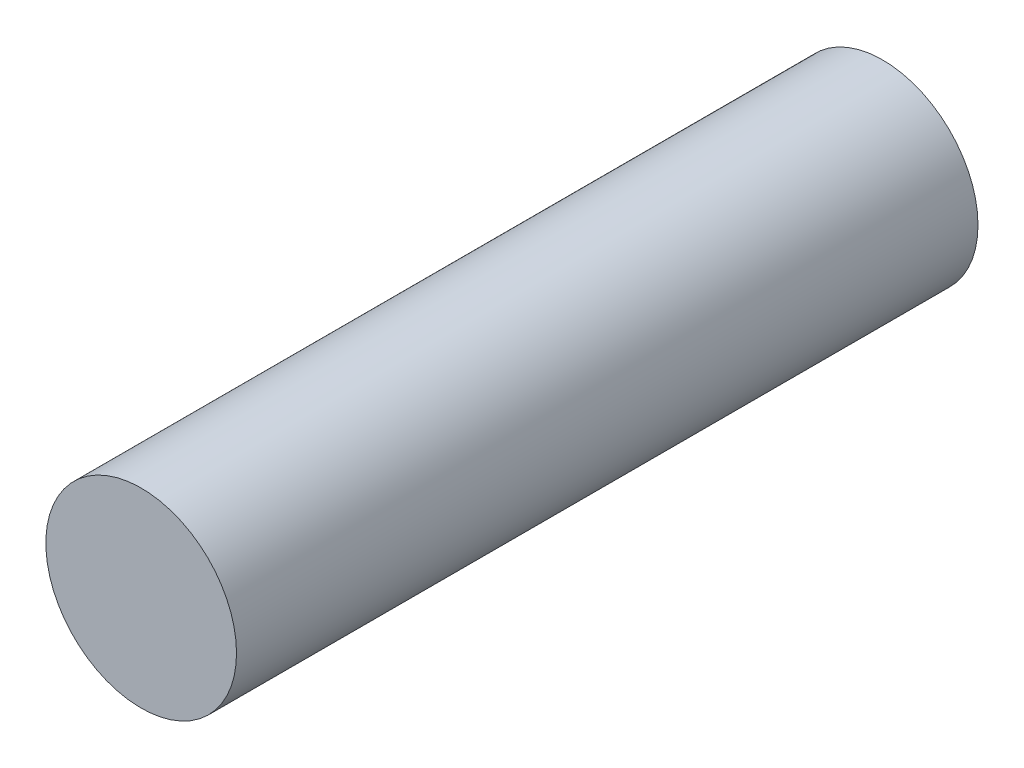
ISO-10303-21;
HEADER;
FILE_DESCRIPTION(('STEP AP214'),'2;1');
FILE_NAME('part.step','',(''),(''),'','','');
FILE_SCHEMA(('AUTOMOTIVE_DESIGN { 1 0 10303 214 1 1 1 1 }'));
ENDSEC;
DATA;
#1=APPLICATION_CONTEXT('core data for automotive mechanical design processes');
#2=APPLICATION_PROTOCOL_DEFINITION('international standard','automotive_design',2000,#1);
#3=PRODUCT_CONTEXT('',#1,'mechanical');
#4=PRODUCT('Part','Part','',(#3));
#5=PRODUCT_RELATED_PRODUCT_CATEGORY('part','',(#4));
#6=PRODUCT_DEFINITION_FORMATION('','',#4);
#7=PRODUCT_DEFINITION_CONTEXT('part definition',#1,'design');
#8=PRODUCT_DEFINITION('design','',#6,#7);
#9=PRODUCT_DEFINITION_SHAPE('','',#8);
#10=(LENGTH_UNIT() NAMED_UNIT(*) SI_UNIT(.MILLI.,.METRE.));
#11=(NAMED_UNIT(*) PLANE_ANGLE_UNIT() SI_UNIT($,.RADIAN.));
#12=(NAMED_UNIT(*) SI_UNIT($,.STERADIAN.) SOLID_ANGLE_UNIT());
#13=UNCERTAINTY_MEASURE_WITH_UNIT(LENGTH_MEASURE(1.E-05),#10,'distance_accuracy_value','');
#14=(GEOMETRIC_REPRESENTATION_CONTEXT(3) GLOBAL_UNCERTAINTY_ASSIGNED_CONTEXT((#13)) GLOBAL_UNIT_ASSIGNED_CONTEXT((#10,
#11,#12)) REPRESENTATION_CONTEXT('',''));
#15=CARTESIAN_POINT('',(0.,0.,0.));
#16=DIRECTION('',(0.,0.,1.));
#17=DIRECTION('',(1.,0.,0.));
#18=AXIS2_PLACEMENT_3D('',#15,#16,#17);
#19=CARTESIAN_POINT('',(0.,0.,70.));
#20=DIRECTION('',(0.,0.,-1.));
#21=DIRECTION('',(-1.,0.,0.));
#22=AXIS2_PLACEMENT_3D('',#19,#20,#21);
#23=CYLINDRICAL_SURFACE('',#22,9.);
#24=CARTESIAN_POINT('',(0.,0.,70.));
#25=DIRECTION('',(0.,0.,1.));
#26=DIRECTION('',(1.,0.,0.));
#27=AXIS2_PLACEMENT_3D('',#24,#25,#26);
#28=CIRCLE('',#27,9.);
#29=CARTESIAN_POINT('',(9.,0.,70.));
#30=VERTEX_POINT('',#29);
#31=EDGE_CURVE('E10',#30,#30,#28,.T.);
#32=ORIENTED_EDGE('',*,*,#31,.F.);
#33=EDGE_LOOP('',(#32));
#34=FACE_BOUND('',#33,.T.);
#35=CARTESIAN_POINT('',(0.,0.,0.));
#36=DIRECTION('',(0.,0.,1.));
#37=DIRECTION('',(1.,0.,0.));
#38=AXIS2_PLACEMENT_3D('',#35,#36,#37);
#39=CIRCLE('',#38,9.);
#40=CARTESIAN_POINT('',(9.,0.,0.));
#41=VERTEX_POINT('',#40);
#42=EDGE_CURVE('E38',#41,#41,#39,.T.);
#43=ORIENTED_EDGE('',*,*,#42,.T.);
#44=EDGE_LOOP('',(#43));
#45=FACE_BOUND('',#44,.T.);
#46=ADVANCED_FACE('F35',(#34,#45),#23,.T.);
#47=CARTESIAN_POINT('',(0.,0.,70.));
#48=DIRECTION('',(0.,0.,1.));
#49=DIRECTION('',(1.,0.,0.));
#50=AXIS2_PLACEMENT_3D('',#47,#48,#49);
#51=PLANE('',#50);
#52=ORIENTED_EDGE('',*,*,#31,.T.);
#53=EDGE_LOOP('',(#52));
#54=FACE_BOUND('',#53,.T.);
#55=ADVANCED_FACE('F50',(#54),#51,.T.);
#56=CARTESIAN_POINT('',(0.,0.,0.));
#57=DIRECTION('',(0.,0.,1.));
#58=DIRECTION('',(1.,0.,0.));
#59=AXIS2_PLACEMENT_3D('',#56,#57,#58);
#60=PLANE('',#59);
#61=ORIENTED_EDGE('',*,*,#42,.F.);
#62=EDGE_LOOP('',(#61));
#63=FACE_BOUND('',#62,.T.);
#64=ADVANCED_FACE('F48',(#63),#60,.F.);
#65=CLOSED_SHELL('',(#46,#55,#64));
#66=MANIFOLD_SOLID_BREP('B2',#65);
#67=ADVANCED_BREP_SHAPE_REPRESENTATION('',(#18,#66),#14);
#68=SHAPE_DEFINITION_REPRESENTATION(#9,#67);
ENDSEC;
END-ISO-10303-21;
